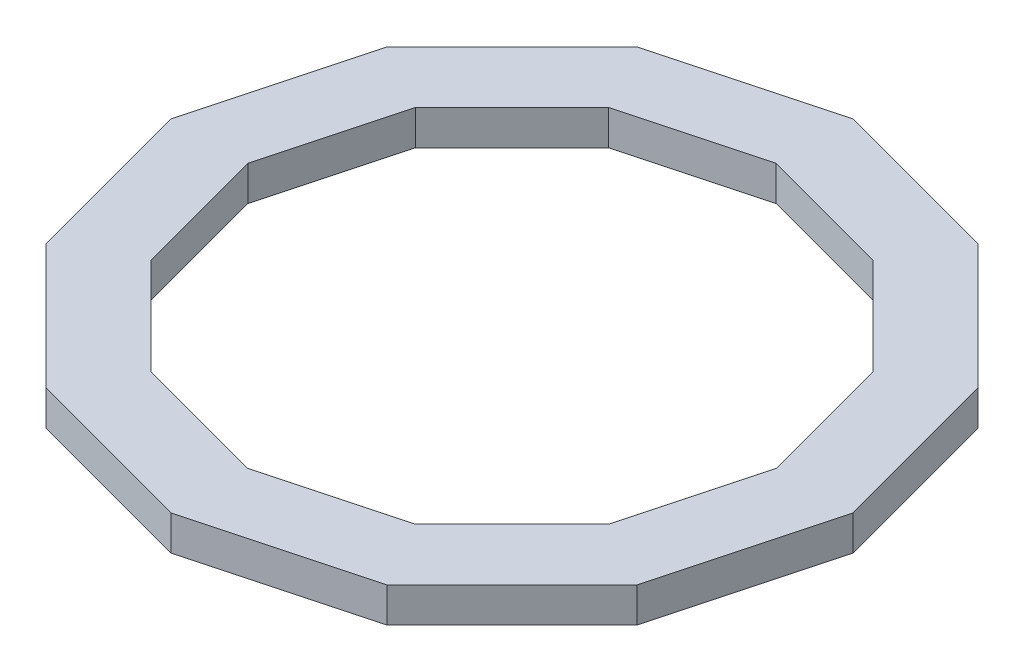
ISO-10303-21;
HEADER;
FILE_DESCRIPTION(('STEP AP214'),'2;1');
FILE_NAME('part.step','',(''),(''),'','','');
FILE_SCHEMA(('AUTOMOTIVE_DESIGN { 1 0 10303 214 1 1 1 1 }'));
ENDSEC;
DATA;
#1=APPLICATION_CONTEXT('core data for automotive mechanical design processes');
#2=APPLICATION_PROTOCOL_DEFINITION('international standard','automotive_design',2000,#1);
#3=PRODUCT_CONTEXT('',#1,'mechanical');
#4=PRODUCT('Part','Part','',(#3));
#5=PRODUCT_RELATED_PRODUCT_CATEGORY('part','',(#4));
#6=PRODUCT_DEFINITION_FORMATION('','',#4);
#7=PRODUCT_DEFINITION_CONTEXT('part definition',#1,'design');
#8=PRODUCT_DEFINITION('design','',#6,#7);
#9=PRODUCT_DEFINITION_SHAPE('','',#8);
#10=(LENGTH_UNIT() NAMED_UNIT(*) SI_UNIT(.MILLI.,.METRE.));
#11=(NAMED_UNIT(*) PLANE_ANGLE_UNIT() SI_UNIT($,.RADIAN.));
#12=(NAMED_UNIT(*) SI_UNIT($,.STERADIAN.) SOLID_ANGLE_UNIT());
#13=UNCERTAINTY_MEASURE_WITH_UNIT(LENGTH_MEASURE(1.E-05),#10,'distance_accuracy_value','');
#14=(GEOMETRIC_REPRESENTATION_CONTEXT(3) GLOBAL_UNCERTAINTY_ASSIGNED_CONTEXT((#13)) GLOBAL_UNIT_ASSIGNED_CONTEXT((#10,
#11,#12)) REPRESENTATION_CONTEXT('',''));
#15=CARTESIAN_POINT('',(0.,0.,0.));
#16=DIRECTION('',(0.,0.,1.));
#17=DIRECTION('',(1.,0.,0.));
#18=AXIS2_PLACEMENT_3D('',#15,#16,#17);
#19=CARTESIAN_POINT('',(0.,19.05,0.));
#20=DIRECTION('',(0.,1.,0.));
#21=DIRECTION('',(0.,0.,1.));
#22=AXIS2_PLACEMENT_3D('',#19,#20,#21);
#23=PLANE('',#22);
#24=DIRECTION('',(0.258819045102521,0.,-0.965925826289068));
#25=VECTOR('',#24,1.);
#26=CARTESIAN_POINT('',(161.481107273546,19.05,93.2311607534207));
#27=LINE('',#26,#25);
#28=CARTESIAN_POINT('',(161.481107273546,19.05,93.2311607534207));
#29=VERTEX_POINT('',#28);
#30=CARTESIAN_POINT('',(186.462321506841,19.05,0.));
#31=VERTEX_POINT('',#30);
#32=EDGE_CURVE('E292',#29,#31,#27,.T.);
#33=ORIENTED_EDGE('',*,*,#32,.T.);
#34=DIRECTION('',(-0.258819045102521,0.,-0.965925826289068));
#35=VECTOR('',#34,1.);
#36=CARTESIAN_POINT('',(186.462321506841,19.05,0.));
#37=LINE('',#36,#35);
#38=CARTESIAN_POINT('',(161.481107273546,19.05,-93.2311607534208));
#39=VERTEX_POINT('',#38);
#40=EDGE_CURVE('E295',#31,#39,#37,.T.);
#41=ORIENTED_EDGE('',*,*,#40,.T.);
#42=DIRECTION('',(-0.707106781186548,0.,-0.707106781186547));
#43=VECTOR('',#42,1.);
#44=CARTESIAN_POINT('',(161.481107273546,19.05,-93.2311607534208));
#45=LINE('',#44,#43);
#46=CARTESIAN_POINT('',(93.2311607534208,19.05,-161.481107273546));
#47=VERTEX_POINT('',#46);
#48=EDGE_CURVE('E298',#39,#47,#45,.T.);
#49=ORIENTED_EDGE('',*,*,#48,.T.);
#50=DIRECTION('',(-0.965925826289068,0.,-0.258819045102521));
#51=VECTOR('',#50,1.);
#52=CARTESIAN_POINT('',(93.2311607534208,19.05,-161.481107273546));
#53=LINE('',#52,#51);
#54=CARTESIAN_POINT('',(0.,19.05,-186.462321506841));
#55=VERTEX_POINT('',#54);
#56=EDGE_CURVE('E300',#47,#55,#53,.T.);
#57=ORIENTED_EDGE('',*,*,#56,.T.);
#58=DIRECTION('',(-0.965925826289068,0.,0.258819045102521));
#59=VECTOR('',#58,1.);
#60=CARTESIAN_POINT('',(0.,19.05,-186.462321506841));
#61=LINE('',#60,#59);
#62=CARTESIAN_POINT('',(-93.2311607534207,19.05,-161.481107273546));
#63=VERTEX_POINT('',#62);
#64=EDGE_CURVE('E302',#55,#63,#61,.T.);
#65=ORIENTED_EDGE('',*,*,#64,.T.);
#66=DIRECTION('',(-0.707106781186547,0.,0.707106781186548));
#67=VECTOR('',#66,1.);
#68=CARTESIAN_POINT('',(-93.2311607534207,19.05,-161.481107273546));
#69=LINE('',#68,#67);
#70=CARTESIAN_POINT('',(-161.481107273546,19.05,-93.2311607534207));
#71=VERTEX_POINT('',#70);
#72=EDGE_CURVE('E304',#63,#71,#69,.T.);
#73=ORIENTED_EDGE('',*,*,#72,.T.);
#74=DIRECTION('',(-0.258819045102521,0.,0.965925826289068));
#75=VECTOR('',#74,1.);
#76=CARTESIAN_POINT('',(-161.481107273546,19.05,-93.2311607534207));
#77=LINE('',#76,#75);
#78=CARTESIAN_POINT('',(-186.462321506841,19.05,1.50859272523053E-13));
#79=VERTEX_POINT('',#78);
#80=EDGE_CURVE('E306',#71,#79,#77,.T.);
#81=ORIENTED_EDGE('',*,*,#80,.T.);
#82=DIRECTION('',(0.258819045102521,0.,0.965925826289068));
#83=VECTOR('',#82,1.);
#84=CARTESIAN_POINT('',(-186.462321506841,19.05,1.50859272523053E-13));
#85=LINE('',#84,#83);
#86=CARTESIAN_POINT('',(-161.481107273546,19.05,93.2311607534208));
#87=VERTEX_POINT('',#86);
#88=EDGE_CURVE('E308',#79,#87,#85,.T.);
#89=ORIENTED_EDGE('',*,*,#88,.T.);
#90=DIRECTION('',(0.707106781186548,0.,0.707106781186547));
#91=VECTOR('',#90,1.);
#92=CARTESIAN_POINT('',(-161.481107273546,19.05,93.2311607534208));
#93=LINE('',#92,#91);
#94=CARTESIAN_POINT('',(-93.2311607534206,19.05,161.481107273546));
#95=VERTEX_POINT('',#94);
#96=EDGE_CURVE('E310',#87,#95,#93,.T.);
#97=ORIENTED_EDGE('',*,*,#96,.T.);
#98=DIRECTION('',(0.965925826289068,0.,0.258819045102521));
#99=VECTOR('',#98,1.);
#100=CARTESIAN_POINT('',(-93.2311607534206,19.05,161.481107273546));
#101=LINE('',#100,#99);
#102=CARTESIAN_POINT('',(0.,19.05,186.462321506841));
#103=VERTEX_POINT('',#102);
#104=EDGE_CURVE('E312',#95,#103,#101,.T.);
#105=ORIENTED_EDGE('',*,*,#104,.T.);
#106=DIRECTION('',(0.965925826289068,0.,-0.258819045102521));
#107=VECTOR('',#106,1.);
#108=CARTESIAN_POINT('',(0.,19.05,186.462321506841));
#109=LINE('',#108,#107);
#110=CARTESIAN_POINT('',(93.2311607534207,19.05,161.481107273546));
#111=VERTEX_POINT('',#110);
#112=EDGE_CURVE('E314',#103,#111,#109,.T.);
#113=ORIENTED_EDGE('',*,*,#112,.T.);
#114=DIRECTION('',(0.707106781186548,0.,-0.707106781186547));
#115=VECTOR('',#114,1.);
#116=CARTESIAN_POINT('',(93.2311607534207,19.05,161.481107273546));
#117=LINE('',#116,#115);
#118=EDGE_CURVE('E316',#111,#29,#117,.T.);
#119=ORIENTED_EDGE('',*,*,#118,.T.);
#120=EDGE_LOOP('',(#33,#41,#49,#57,#65,#73,#81,#89,#97,#105,#113,#119));
#121=FACE_BOUND('',#120,.T.);
#122=DIRECTION('',(-0.258819045102521,0.,-0.965925826289068));
#123=VECTOR('',#122,1.);
#124=CARTESIAN_POINT('',(144.388697534976,19.05,0.));
#125=LINE('',#124,#123);
#126=CARTESIAN_POINT('',(144.388697534976,19.05,0.));
#127=VERTEX_POINT('',#126);
#128=CARTESIAN_POINT('',(125.044280084636,19.05,-72.1943487674879));
#129=VERTEX_POINT('',#128);
#130=EDGE_CURVE('E203',#127,#129,#125,.T.);
#131=ORIENTED_EDGE('',*,*,#130,.F.);
#132=DIRECTION('',(0.25881904510252,0.,-0.965925826289068));
#133=VECTOR('',#132,1.);
#134=CARTESIAN_POINT('',(125.044280084636,19.05,72.1943487674877));
#135=LINE('',#134,#133);
#136=CARTESIAN_POINT('',(125.044280084636,19.05,72.1943487674877));
#137=VERTEX_POINT('',#136);
#138=EDGE_CURVE('E195',#137,#127,#135,.T.);
#139=ORIENTED_EDGE('',*,*,#138,.F.);
#140=DIRECTION('',(0.707106781186547,0.,-0.707106781186548));
#141=VECTOR('',#140,1.);
#142=CARTESIAN_POINT('',(72.1943487674878,19.05,125.044280084636));
#143=LINE('',#142,#141);
#144=CARTESIAN_POINT('',(72.1943487674878,19.05,125.044280084636));
#145=VERTEX_POINT('',#144);
#146=EDGE_CURVE('E237',#145,#137,#143,.T.);
#147=ORIENTED_EDGE('',*,*,#146,.F.);
#148=DIRECTION('',(0.965925826289068,0.,-0.258819045102521));
#149=VECTOR('',#148,1.);
#150=CARTESIAN_POINT('',(0.,19.05,144.388697534976));
#151=LINE('',#150,#149);
#152=CARTESIAN_POINT('',(0.,19.05,144.388697534976));
#153=VERTEX_POINT('',#152);
#154=EDGE_CURVE('E235',#153,#145,#151,.T.);
#155=ORIENTED_EDGE('',*,*,#154,.F.);
#156=DIRECTION('',(0.965925826289068,0.,0.25881904510252));
#157=VECTOR('',#156,1.);
#158=CARTESIAN_POINT('',(-72.1943487674877,19.05,125.044280084636));
#159=LINE('',#158,#157);
#160=CARTESIAN_POINT('',(-72.1943487674877,19.05,125.044280084636));
#161=VERTEX_POINT('',#160);
#162=EDGE_CURVE('E233',#161,#153,#159,.T.);
#163=ORIENTED_EDGE('',*,*,#162,.F.);
#164=DIRECTION('',(0.707106781186548,0.,0.707106781186547));
#165=VECTOR('',#164,1.);
#166=CARTESIAN_POINT('',(-125.044280084636,19.05,72.1943487674879));
#167=LINE('',#166,#165);
#168=CARTESIAN_POINT('',(-125.044280084636,19.05,72.1943487674879));
#169=VERTEX_POINT('',#168);
#170=EDGE_CURVE('E231',#169,#161,#167,.T.);
#171=ORIENTED_EDGE('',*,*,#170,.F.);
#172=DIRECTION('',(0.258819045102522,0.,0.965925826289068));
#173=VECTOR('',#172,1.);
#174=CARTESIAN_POINT('',(-144.388697534976,19.05,0.));
#175=LINE('',#174,#173);
#176=CARTESIAN_POINT('',(-144.388697534976,19.05,0.));
#177=VERTEX_POINT('',#176);
#178=EDGE_CURVE('E228',#177,#169,#175,.T.);
#179=ORIENTED_EDGE('',*,*,#178,.F.);
#180=DIRECTION('',(-0.258819045102521,0.,0.965925826289068));
#181=VECTOR('',#180,1.);
#182=CARTESIAN_POINT('',(-125.044280084636,19.05,-72.1943487674877));
#183=LINE('',#182,#181);
#184=CARTESIAN_POINT('',(-125.044280084636,19.05,-72.1943487674877));
#185=VERTEX_POINT('',#184);
#186=EDGE_CURVE('E226',#185,#177,#183,.T.);
#187=ORIENTED_EDGE('',*,*,#186,.F.);
#188=DIRECTION('',(-0.707106781186547,0.,0.707106781186548));
#189=VECTOR('',#188,1.);
#190=CARTESIAN_POINT('',(-72.1943487674878,19.05,-125.044280084636));
#191=LINE('',#190,#189);
#192=CARTESIAN_POINT('',(-72.1943487674878,19.05,-125.044280084636));
#193=VERTEX_POINT('',#192);
#194=EDGE_CURVE('E224',#193,#185,#191,.T.);
#195=ORIENTED_EDGE('',*,*,#194,.F.);
#196=DIRECTION('',(-0.965925826289068,0.,0.258819045102521));
#197=VECTOR('',#196,1.);
#198=CARTESIAN_POINT('',(0.,19.05,-144.388697534976));
#199=LINE('',#198,#197);
#200=CARTESIAN_POINT('',(0.,19.05,-144.388697534976));
#201=VERTEX_POINT('',#200);
#202=EDGE_CURVE('E222',#201,#193,#199,.T.);
#203=ORIENTED_EDGE('',*,*,#202,.F.);
#204=DIRECTION('',(-0.965925826289068,0.,-0.25881904510252));
#205=VECTOR('',#204,1.);
#206=CARTESIAN_POINT('',(72.1943487674877,19.05,-125.044280084636));
#207=LINE('',#206,#205);
#208=CARTESIAN_POINT('',(72.1943487674877,19.05,-125.044280084636));
#209=VERTEX_POINT('',#208);
#210=EDGE_CURVE('E218',#209,#201,#207,.T.);
#211=ORIENTED_EDGE('',*,*,#210,.F.);
#212=DIRECTION('',(-0.707106781186548,0.,-0.707106781186547));
#213=VECTOR('',#212,1.);
#214=CARTESIAN_POINT('',(125.044280084636,19.05,-72.1943487674879));
#215=LINE('',#214,#213);
#216=EDGE_CURVE('E216',#129,#209,#215,.T.);
#217=ORIENTED_EDGE('',*,*,#216,.F.);
#218=EDGE_LOOP('',(#131,#139,#147,#155,#163,#171,#179,#187,#195,#203,#211,#217));
#219=FACE_BOUND('',#218,.T.);
#220=ADVANCED_FACE('F34',(#121,#219),#23,.T.);
#221=CARTESIAN_POINT('',(0.,0.,0.));
#222=DIRECTION('',(0.,1.,0.));
#223=DIRECTION('',(0.,0.,1.));
#224=AXIS2_PLACEMENT_3D('',#221,#222,#223);
#225=PLANE('',#224);
#226=DIRECTION('',(0.258819045102521,0.,-0.965925826289068));
#227=VECTOR('',#226,1.);
#228=CARTESIAN_POINT('',(161.481107273546,0.,93.2311607534207));
#229=LINE('',#228,#227);
#230=CARTESIAN_POINT('',(161.481107273546,0.,93.2311607534207));
#231=VERTEX_POINT('',#230);
#232=CARTESIAN_POINT('',(186.462321506841,0.,0.));
#233=VERTEX_POINT('',#232);
#234=EDGE_CURVE('E211',#231,#233,#229,.T.);
#235=ORIENTED_EDGE('',*,*,#234,.F.);
#236=DIRECTION('',(0.707106781186548,0.,-0.707106781186547));
#237=VECTOR('',#236,1.);
#238=CARTESIAN_POINT('',(93.2311607534207,0.,161.481107273546));
#239=LINE('',#238,#237);
#240=CARTESIAN_POINT('',(93.2311607534207,0.,161.481107273546));
#241=VERTEX_POINT('',#240);
#242=EDGE_CURVE('E296',#241,#231,#239,.T.);
#243=ORIENTED_EDGE('',*,*,#242,.F.);
#244=DIRECTION('',(0.965925826289068,0.,-0.258819045102521));
#245=VECTOR('',#244,1.);
#246=CARTESIAN_POINT('',(0.,0.,186.462321506841));
#247=LINE('',#246,#245);
#248=CARTESIAN_POINT('',(0.,0.,186.462321506841));
#249=VERTEX_POINT('',#248);
#250=EDGE_CURVE('E341',#249,#241,#247,.T.);
#251=ORIENTED_EDGE('',*,*,#250,.F.);
#252=DIRECTION('',(0.965925826289068,0.,0.258819045102521));
#253=VECTOR('',#252,1.);
#254=CARTESIAN_POINT('',(-93.2311607534206,0.,161.481107273546));
#255=LINE('',#254,#253);
#256=CARTESIAN_POINT('',(-93.2311607534206,0.,161.481107273546));
#257=VERTEX_POINT('',#256);
#258=EDGE_CURVE('E338',#257,#249,#255,.T.);
#259=ORIENTED_EDGE('',*,*,#258,.F.);
#260=DIRECTION('',(0.707106781186548,0.,0.707106781186547));
#261=VECTOR('',#260,1.);
#262=CARTESIAN_POINT('',(-161.481107273546,0.,93.2311607534208));
#263=LINE('',#262,#261);
#264=CARTESIAN_POINT('',(-161.481107273546,0.,93.2311607534208));
#265=VERTEX_POINT('',#264);
#266=EDGE_CURVE('E336',#265,#257,#263,.T.);
#267=ORIENTED_EDGE('',*,*,#266,.F.);
#268=DIRECTION('',(0.258819045102521,0.,0.965925826289068));
#269=VECTOR('',#268,1.);
#270=CARTESIAN_POINT('',(-186.462321506841,0.,1.50859272523053E-13));
#271=LINE('',#270,#269);
#272=CARTESIAN_POINT('',(-186.462321506841,0.,1.50859272523053E-13));
#273=VERTEX_POINT('',#272);
#274=EDGE_CURVE('E333',#273,#265,#271,.T.);
#275=ORIENTED_EDGE('',*,*,#274,.F.);
#276=DIRECTION('',(-0.258819045102521,0.,0.965925826289068));
#277=VECTOR('',#276,1.);
#278=CARTESIAN_POINT('',(-161.481107273546,0.,-93.2311607534207));
#279=LINE('',#278,#277);
#280=CARTESIAN_POINT('',(-161.481107273546,0.,-93.2311607534207));
#281=VERTEX_POINT('',#280);
#282=EDGE_CURVE('E331',#281,#273,#279,.T.);
#283=ORIENTED_EDGE('',*,*,#282,.F.);
#284=DIRECTION('',(-0.707106781186547,0.,0.707106781186548));
#285=VECTOR('',#284,1.);
#286=CARTESIAN_POINT('',(-93.2311607534207,0.,-161.481107273546));
#287=LINE('',#286,#285);
#288=CARTESIAN_POINT('',(-93.2311607534207,0.,-161.481107273546));
#289=VERTEX_POINT('',#288);
#290=EDGE_CURVE('E329',#289,#281,#287,.T.);
#291=ORIENTED_EDGE('',*,*,#290,.F.);
#292=DIRECTION('',(-0.965925826289068,0.,0.258819045102521));
#293=VECTOR('',#292,1.);
#294=CARTESIAN_POINT('',(0.,0.,-186.462321506841));
#295=LINE('',#294,#293);
#296=CARTESIAN_POINT('',(0.,0.,-186.462321506841));
#297=VERTEX_POINT('',#296);
#298=EDGE_CURVE('E327',#297,#289,#295,.T.);
#299=ORIENTED_EDGE('',*,*,#298,.F.);
#300=DIRECTION('',(-0.965925826289068,0.,-0.258819045102521));
#301=VECTOR('',#300,1.);
#302=CARTESIAN_POINT('',(93.2311607534208,0.,-161.481107273546));
#303=LINE('',#302,#301);
#304=CARTESIAN_POINT('',(93.2311607534208,0.,-161.481107273546));
#305=VERTEX_POINT('',#304);
#306=EDGE_CURVE('E325',#305,#297,#303,.T.);
#307=ORIENTED_EDGE('',*,*,#306,.F.);
#308=DIRECTION('',(-0.707106781186548,0.,-0.707106781186547));
#309=VECTOR('',#308,1.);
#310=CARTESIAN_POINT('',(161.481107273546,0.,-93.2311607534208));
#311=LINE('',#310,#309);
#312=CARTESIAN_POINT('',(161.481107273546,0.,-93.2311607534208));
#313=VERTEX_POINT('',#312);
#314=EDGE_CURVE('E323',#313,#305,#311,.T.);
#315=ORIENTED_EDGE('',*,*,#314,.F.);
#316=DIRECTION('',(-0.258819045102521,0.,-0.965925826289068));
#317=VECTOR('',#316,1.);
#318=CARTESIAN_POINT('',(186.462321506841,0.,0.));
#319=LINE('',#318,#317);
#320=EDGE_CURVE('E321',#233,#313,#319,.T.);
#321=ORIENTED_EDGE('',*,*,#320,.F.);
#322=EDGE_LOOP('',(#235,#243,#251,#259,#267,#275,#283,#291,#299,#307,#315,#321));
#323=FACE_BOUND('',#322,.T.);
#324=DIRECTION('',(0.25881904510252,0.,-0.965925826289068));
#325=VECTOR('',#324,1.);
#326=CARTESIAN_POINT('',(125.044280084636,0.,72.1943487674877));
#327=LINE('',#326,#325);
#328=CARTESIAN_POINT('',(125.044280084636,0.,72.1943487674877));
#329=VERTEX_POINT('',#328);
#330=CARTESIAN_POINT('',(144.388697534976,0.,0.));
#331=VERTEX_POINT('',#330);
#332=EDGE_CURVE('E57',#329,#331,#327,.T.);
#333=ORIENTED_EDGE('',*,*,#332,.T.);
#334=DIRECTION('',(-0.258819045102521,0.,-0.965925826289068));
#335=VECTOR('',#334,1.);
#336=CARTESIAN_POINT('',(144.388697534976,0.,0.));
#337=LINE('',#336,#335);
#338=CARTESIAN_POINT('',(125.044280084636,0.,-72.1943487674879));
#339=VERTEX_POINT('',#338);
#340=EDGE_CURVE('E210',#331,#339,#337,.T.);
#341=ORIENTED_EDGE('',*,*,#340,.T.);
#342=DIRECTION('',(-0.707106781186548,0.,-0.707106781186547));
#343=VECTOR('',#342,1.);
#344=CARTESIAN_POINT('',(125.044280084636,0.,-72.1943487674879));
#345=LINE('',#344,#343);
#346=CARTESIAN_POINT('',(72.1943487674877,0.,-125.044280084636));
#347=VERTEX_POINT('',#346);
#348=EDGE_CURVE('E241',#339,#347,#345,.T.);
#349=ORIENTED_EDGE('',*,*,#348,.T.);
#350=DIRECTION('',(-0.965925826289068,0.,-0.25881904510252));
#351=VECTOR('',#350,1.);
#352=CARTESIAN_POINT('',(72.1943487674877,0.,-125.044280084636));
#353=LINE('',#352,#351);
#354=CARTESIAN_POINT('',(0.,0.,-144.388697534976));
#355=VERTEX_POINT('',#354);
#356=EDGE_CURVE('E244',#347,#355,#353,.T.);
#357=ORIENTED_EDGE('',*,*,#356,.T.);
#358=DIRECTION('',(-0.965925826289068,0.,0.258819045102521));
#359=VECTOR('',#358,1.);
#360=CARTESIAN_POINT('',(0.,0.,-144.388697534976));
#361=LINE('',#360,#359);
#362=CARTESIAN_POINT('',(-72.1943487674878,0.,-125.044280084636));
#363=VERTEX_POINT('',#362);
#364=EDGE_CURVE('E247',#355,#363,#361,.T.);
#365=ORIENTED_EDGE('',*,*,#364,.T.);
#366=DIRECTION('',(-0.707106781186547,0.,0.707106781186548));
#367=VECTOR('',#366,1.);
#368=CARTESIAN_POINT('',(-72.1943487674878,0.,-125.044280084636));
#369=LINE('',#368,#367);
#370=CARTESIAN_POINT('',(-125.044280084636,0.,-72.1943487674877));
#371=VERTEX_POINT('',#370);
#372=EDGE_CURVE('E251',#363,#371,#369,.T.);
#373=ORIENTED_EDGE('',*,*,#372,.T.);
#374=DIRECTION('',(-0.258819045102521,0.,0.965925826289068));
#375=VECTOR('',#374,1.);
#376=CARTESIAN_POINT('',(-125.044280084636,0.,-72.1943487674877));
#377=LINE('',#376,#375);
#378=CARTESIAN_POINT('',(-144.388697534976,0.,0.));
#379=VERTEX_POINT('',#378);
#380=EDGE_CURVE('E254',#371,#379,#377,.T.);
#381=ORIENTED_EDGE('',*,*,#380,.T.);
#382=DIRECTION('',(0.258819045102522,0.,0.965925826289068));
#383=VECTOR('',#382,1.);
#384=CARTESIAN_POINT('',(-144.388697534976,0.,0.));
#385=LINE('',#384,#383);
#386=CARTESIAN_POINT('',(-125.044280084636,0.,72.1943487674879));
#387=VERTEX_POINT('',#386);
#388=EDGE_CURVE('E257',#379,#387,#385,.T.);
#389=ORIENTED_EDGE('',*,*,#388,.T.);
#390=DIRECTION('',(0.707106781186548,0.,0.707106781186547));
#391=VECTOR('',#390,1.);
#392=CARTESIAN_POINT('',(-125.044280084636,0.,72.1943487674879));
#393=LINE('',#392,#391);
#394=CARTESIAN_POINT('',(-72.1943487674877,0.,125.044280084636));
#395=VERTEX_POINT('',#394);
#396=EDGE_CURVE('E260',#387,#395,#393,.T.);
#397=ORIENTED_EDGE('',*,*,#396,.T.);
#398=DIRECTION('',(0.965925826289068,0.,0.25881904510252));
#399=VECTOR('',#398,1.);
#400=CARTESIAN_POINT('',(-72.1943487674877,0.,125.044280084636));
#401=LINE('',#400,#399);
#402=CARTESIAN_POINT('',(0.,0.,144.388697534976));
#403=VERTEX_POINT('',#402);
#404=EDGE_CURVE('E263',#395,#403,#401,.T.);
#405=ORIENTED_EDGE('',*,*,#404,.T.);
#406=DIRECTION('',(0.965925826289068,0.,-0.258819045102521));
#407=VECTOR('',#406,1.);
#408=CARTESIAN_POINT('',(0.,0.,144.388697534976));
#409=LINE('',#408,#407);
#410=CARTESIAN_POINT('',(72.1943487674878,0.,125.044280084636));
#411=VERTEX_POINT('',#410);
#412=EDGE_CURVE('E266',#403,#411,#409,.T.);
#413=ORIENTED_EDGE('',*,*,#412,.T.);
#414=DIRECTION('',(0.707106781186547,0.,-0.707106781186548));
#415=VECTOR('',#414,1.);
#416=CARTESIAN_POINT('',(72.1943487674878,0.,125.044280084636));
#417=LINE('',#416,#415);
#418=EDGE_CURVE('E204',#411,#329,#417,.T.);
#419=ORIENTED_EDGE('',*,*,#418,.T.);
#420=EDGE_LOOP('',(#333,#341,#349,#357,#365,#373,#381,#389,#397,#405,#413,#419));
#421=FACE_BOUND('',#420,.T.);
#422=ADVANCED_FACE('F383',(#323,#421),#225,.F.);
#423=CARTESIAN_POINT('',(161.481107273546,19.05,93.2311607534207));
#424=DIRECTION('',(-0.965925826289068,0.,-0.258819045102521));
#425=DIRECTION('',(-0.258819045102521,0.,0.965925826289068));
#426=AXIS2_PLACEMENT_3D('',#423,#424,#425);
#427=PLANE('',#426);
#428=ORIENTED_EDGE('',*,*,#234,.T.);
#429=DIRECTION('',(0.,-1.,0.));
#430=VECTOR('',#429,1.);
#431=CARTESIAN_POINT('',(186.462321506841,19.05,0.));
#432=LINE('',#431,#430);
#433=EDGE_CURVE('E11',#31,#233,#432,.T.);
#434=ORIENTED_EDGE('',*,*,#433,.F.);
#435=ORIENTED_EDGE('',*,*,#32,.F.);
#436=DIRECTION('',(0.,-1.,0.));
#437=VECTOR('',#436,1.);
#438=CARTESIAN_POINT('',(161.481107273546,19.05,93.2311607534207));
#439=LINE('',#438,#437);
#440=EDGE_CURVE('E318',#29,#231,#439,.T.);
#441=ORIENTED_EDGE('',*,*,#440,.T.);
#442=EDGE_LOOP('',(#428,#434,#435,#441));
#443=FACE_BOUND('',#442,.T.);
#444=ADVANCED_FACE('F36',(#443),#427,.F.);
#445=CARTESIAN_POINT('',(186.462321506841,19.05,0.));
#446=DIRECTION('',(-0.965925826289068,0.,0.258819045102521));
#447=DIRECTION('',(0.258819045102521,0.,0.965925826289068));
#448=AXIS2_PLACEMENT_3D('',#445,#446,#447);
#449=PLANE('',#448);
#450=ORIENTED_EDGE('',*,*,#320,.T.);
#451=DIRECTION('',(0.,-1.,0.));
#452=VECTOR('',#451,1.);
#453=CARTESIAN_POINT('',(161.481107273546,19.05,-93.2311607534208));
#454=LINE('',#453,#452);
#455=EDGE_CURVE('E42',#39,#313,#454,.T.);
#456=ORIENTED_EDGE('',*,*,#455,.F.);
#457=ORIENTED_EDGE('',*,*,#40,.F.);
#458=ORIENTED_EDGE('',*,*,#433,.T.);
#459=EDGE_LOOP('',(#450,#456,#457,#458));
#460=FACE_BOUND('',#459,.T.);
#461=ADVANCED_FACE('F400',(#460),#449,.F.);
#462=CARTESIAN_POINT('',(161.481107273546,19.05,-93.2311607534208));
#463=DIRECTION('',(-0.707106781186547,0.,0.707106781186548));
#464=DIRECTION('',(0.707106781186548,0.,0.707106781186547));
#465=AXIS2_PLACEMENT_3D('',#462,#463,#464);
#466=PLANE('',#465);
#467=ORIENTED_EDGE('',*,*,#314,.T.);
#468=DIRECTION('',(0.,-1.,0.));
#469=VECTOR('',#468,1.);
#470=CARTESIAN_POINT('',(93.2311607534208,19.05,-161.481107273546));
#471=LINE('',#470,#469);
#472=EDGE_CURVE('E370',#47,#305,#471,.T.);
#473=ORIENTED_EDGE('',*,*,#472,.F.);
#474=ORIENTED_EDGE('',*,*,#48,.F.);
#475=ORIENTED_EDGE('',*,*,#455,.T.);
#476=EDGE_LOOP('',(#467,#473,#474,#475));
#477=FACE_BOUND('',#476,.T.);
#478=ADVANCED_FACE('F377',(#477),#466,.F.);
#479=CARTESIAN_POINT('',(93.2311607534208,19.05,-161.481107273546));
#480=DIRECTION('',(-0.258819045102521,0.,0.965925826289068));
#481=DIRECTION('',(0.965925826289068,0.,0.258819045102521));
#482=AXIS2_PLACEMENT_3D('',#479,#480,#481);
#483=PLANE('',#482);
#484=ORIENTED_EDGE('',*,*,#306,.T.);
#485=DIRECTION('',(0.,-1.,0.));
#486=VECTOR('',#485,1.);
#487=CARTESIAN_POINT('',(0.,19.05,-186.462321506841));
#488=LINE('',#487,#486);
#489=EDGE_CURVE('E367',#55,#297,#488,.T.);
#490=ORIENTED_EDGE('',*,*,#489,.F.);
#491=ORIENTED_EDGE('',*,*,#56,.F.);
#492=ORIENTED_EDGE('',*,*,#472,.T.);
#493=EDGE_LOOP('',(#484,#490,#491,#492));
#494=FACE_BOUND('',#493,.T.);
#495=ADVANCED_FACE('F389',(#494),#483,.F.);
#496=CARTESIAN_POINT('',(0.,19.05,-186.462321506841));
#497=DIRECTION('',(0.258819045102521,0.,0.965925826289068));
#498=DIRECTION('',(0.965925826289068,0.,-0.258819045102521));
#499=AXIS2_PLACEMENT_3D('',#496,#497,#498);
#500=PLANE('',#499);
#501=ORIENTED_EDGE('',*,*,#298,.T.);
#502=DIRECTION('',(0.,-1.,0.));
#503=VECTOR('',#502,1.);
#504=CARTESIAN_POINT('',(-93.2311607534207,19.05,-161.481107273546));
#505=LINE('',#504,#503);
#506=EDGE_CURVE('E364',#63,#289,#505,.T.);
#507=ORIENTED_EDGE('',*,*,#506,.F.);
#508=ORIENTED_EDGE('',*,*,#64,.F.);
#509=ORIENTED_EDGE('',*,*,#489,.T.);
#510=EDGE_LOOP('',(#501,#507,#508,#509));
#511=FACE_BOUND('',#510,.T.);
#512=ADVANCED_FACE('F393',(#511),#500,.F.);
#513=CARTESIAN_POINT('',(-93.2311607534207,19.05,-161.481107273546));
#514=DIRECTION('',(0.707106781186548,0.,0.707106781186547));
#515=DIRECTION('',(0.707106781186547,0.,-0.707106781186548));
#516=AXIS2_PLACEMENT_3D('',#513,#514,#515);
#517=PLANE('',#516);
#518=ORIENTED_EDGE('',*,*,#290,.T.);
#519=DIRECTION('',(0.,-1.,0.));
#520=VECTOR('',#519,1.);
#521=CARTESIAN_POINT('',(-161.481107273546,19.05,-93.2311607534207));
#522=LINE('',#521,#520);
#523=EDGE_CURVE('E361',#71,#281,#522,.T.);
#524=ORIENTED_EDGE('',*,*,#523,.F.);
#525=ORIENTED_EDGE('',*,*,#72,.F.);
#526=ORIENTED_EDGE('',*,*,#506,.T.);
#527=EDGE_LOOP('',(#518,#524,#525,#526));
#528=FACE_BOUND('',#527,.T.);
#529=ADVANCED_FACE('F433',(#528),#517,.F.);
#530=CARTESIAN_POINT('',(-161.481107273546,19.05,-93.2311607534207));
#531=DIRECTION('',(0.965925826289068,0.,0.258819045102521));
#532=DIRECTION('',(0.258819045102521,0.,-0.965925826289068));
#533=AXIS2_PLACEMENT_3D('',#530,#531,#532);
#534=PLANE('',#533);
#535=ORIENTED_EDGE('',*,*,#282,.T.);
#536=DIRECTION('',(0.,-1.,0.));
#537=VECTOR('',#536,1.);
#538=CARTESIAN_POINT('',(-186.462321506841,19.05,1.50859272523053E-13));
#539=LINE('',#538,#537);
#540=EDGE_CURVE('E358',#79,#273,#539,.T.);
#541=ORIENTED_EDGE('',*,*,#540,.F.);
#542=ORIENTED_EDGE('',*,*,#80,.F.);
#543=ORIENTED_EDGE('',*,*,#523,.T.);
#544=EDGE_LOOP('',(#535,#541,#542,#543));
#545=FACE_BOUND('',#544,.T.);
#546=ADVANCED_FACE('F431',(#545),#534,.F.);
#547=CARTESIAN_POINT('',(-186.462321506841,19.05,1.50859272523053E-13));
#548=DIRECTION('',(0.965925826289068,0.,-0.258819045102521));
#549=DIRECTION('',(-0.258819045102521,0.,-0.965925826289068));
#550=AXIS2_PLACEMENT_3D('',#547,#548,#549);
#551=PLANE('',#550);
#552=ORIENTED_EDGE('',*,*,#274,.T.);
#553=DIRECTION('',(0.,-1.,0.));
#554=VECTOR('',#553,1.);
#555=CARTESIAN_POINT('',(-161.481107273546,19.05,93.2311607534208));
#556=LINE('',#555,#554);
#557=EDGE_CURVE('E355',#87,#265,#556,.T.);
#558=ORIENTED_EDGE('',*,*,#557,.F.);
#559=ORIENTED_EDGE('',*,*,#88,.F.);
#560=ORIENTED_EDGE('',*,*,#540,.T.);
#561=EDGE_LOOP('',(#552,#558,#559,#560));
#562=FACE_BOUND('',#561,.T.);
#563=ADVANCED_FACE('F427',(#562),#551,.F.);
#564=CARTESIAN_POINT('',(-161.481107273546,19.05,93.2311607534208));
#565=DIRECTION('',(0.707106781186547,0.,-0.707106781186548));
#566=DIRECTION('',(-0.707106781186548,0.,-0.707106781186547));
#567=AXIS2_PLACEMENT_3D('',#564,#565,#566);
#568=PLANE('',#567);
#569=ORIENTED_EDGE('',*,*,#266,.T.);
#570=DIRECTION('',(0.,-1.,0.));
#571=VECTOR('',#570,1.);
#572=CARTESIAN_POINT('',(-93.2311607534206,19.05,161.481107273546));
#573=LINE('',#572,#571);
#574=EDGE_CURVE('E352',#95,#257,#573,.T.);
#575=ORIENTED_EDGE('',*,*,#574,.F.);
#576=ORIENTED_EDGE('',*,*,#96,.F.);
#577=ORIENTED_EDGE('',*,*,#557,.T.);
#578=EDGE_LOOP('',(#569,#575,#576,#577));
#579=FACE_BOUND('',#578,.T.);
#580=ADVANCED_FACE('F422',(#579),#568,.F.);
#581=CARTESIAN_POINT('',(-93.2311607534206,19.05,161.481107273546));
#582=DIRECTION('',(0.258819045102521,0.,-0.965925826289068));
#583=DIRECTION('',(-0.965925826289068,0.,-0.258819045102521));
#584=AXIS2_PLACEMENT_3D('',#581,#582,#583);
#585=PLANE('',#584);
#586=ORIENTED_EDGE('',*,*,#258,.T.);
#587=DIRECTION('',(0.,-1.,0.));
#588=VECTOR('',#587,1.);
#589=CARTESIAN_POINT('',(0.,19.05,186.462321506841));
#590=LINE('',#589,#588);
#591=EDGE_CURVE('E349',#103,#249,#590,.T.);
#592=ORIENTED_EDGE('',*,*,#591,.F.);
#593=ORIENTED_EDGE('',*,*,#104,.F.);
#594=ORIENTED_EDGE('',*,*,#574,.T.);
#595=EDGE_LOOP('',(#586,#592,#593,#594));
#596=FACE_BOUND('',#595,.T.);
#597=ADVANCED_FACE('F416',(#596),#585,.F.);
#598=CARTESIAN_POINT('',(0.,19.05,186.462321506841));
#599=DIRECTION('',(-0.258819045102521,0.,-0.965925826289068));
#600=DIRECTION('',(-0.965925826289068,0.,0.258819045102521));
#601=AXIS2_PLACEMENT_3D('',#598,#599,#600);
#602=PLANE('',#601);
#603=ORIENTED_EDGE('',*,*,#250,.T.);
#604=DIRECTION('',(0.,-1.,0.));
#605=VECTOR('',#604,1.);
#606=CARTESIAN_POINT('',(93.2311607534207,19.05,161.481107273546));
#607=LINE('',#606,#605);
#608=EDGE_CURVE('E346',#111,#241,#607,.T.);
#609=ORIENTED_EDGE('',*,*,#608,.F.);
#610=ORIENTED_EDGE('',*,*,#112,.F.);
#611=ORIENTED_EDGE('',*,*,#591,.T.);
#612=EDGE_LOOP('',(#603,#609,#610,#611));
#613=FACE_BOUND('',#612,.T.);
#614=ADVANCED_FACE('F412',(#613),#602,.F.);
#615=CARTESIAN_POINT('',(93.2311607534207,19.05,161.481107273546));
#616=DIRECTION('',(-0.707106781186547,0.,-0.707106781186548));
#617=DIRECTION('',(-0.707106781186548,0.,0.707106781186547));
#618=AXIS2_PLACEMENT_3D('',#615,#616,#617);
#619=PLANE('',#618);
#620=ORIENTED_EDGE('',*,*,#242,.T.);
#621=ORIENTED_EDGE('',*,*,#440,.F.);
#622=ORIENTED_EDGE('',*,*,#118,.F.);
#623=ORIENTED_EDGE('',*,*,#608,.T.);
#624=EDGE_LOOP('',(#620,#621,#622,#623));
#625=FACE_BOUND('',#624,.T.);
#626=ADVANCED_FACE('F407',(#625),#619,.F.);
#627=CARTESIAN_POINT('',(125.044280084636,19.05,72.1943487674877));
#628=DIRECTION('',(-0.965925826289068,0.,-0.25881904510252));
#629=DIRECTION('',(-0.258819045102521,0.,0.965925826289069));
#630=AXIS2_PLACEMENT_3D('',#627,#628,#629);
#631=PLANE('',#630);
#632=ORIENTED_EDGE('',*,*,#332,.F.);
#633=DIRECTION('',(0.,-1.,0.));
#634=VECTOR('',#633,1.);
#635=CARTESIAN_POINT('',(125.044280084636,19.05,72.1943487674877));
#636=LINE('',#635,#634);
#637=EDGE_CURVE('E199',#137,#329,#636,.T.);
#638=ORIENTED_EDGE('',*,*,#637,.F.);
#639=ORIENTED_EDGE('',*,*,#138,.T.);
#640=DIRECTION('',(0.,-1.,0.));
#641=VECTOR('',#640,1.);
#642=CARTESIAN_POINT('',(144.388697534976,19.05,0.));
#643=LINE('',#642,#641);
#644=EDGE_CURVE('E198',#127,#331,#643,.T.);
#645=ORIENTED_EDGE('',*,*,#644,.T.);
#646=EDGE_LOOP('',(#632,#638,#639,#645));
#647=FACE_BOUND('',#646,.T.);
#648=ADVANCED_FACE('F197',(#647),#631,.T.);
#649=CARTESIAN_POINT('',(144.388697534976,19.05,0.));
#650=DIRECTION('',(-0.965925826289068,0.,0.258819045102521));
#651=DIRECTION('',(0.258819045102521,0.,0.965925826289068));
#652=AXIS2_PLACEMENT_3D('',#649,#650,#651);
#653=PLANE('',#652);
#654=ORIENTED_EDGE('',*,*,#340,.F.);
#655=ORIENTED_EDGE('',*,*,#644,.F.);
#656=ORIENTED_EDGE('',*,*,#130,.T.);
#657=DIRECTION('',(0.,-1.,0.));
#658=VECTOR('',#657,1.);
#659=CARTESIAN_POINT('',(125.044280084636,19.05,-72.1943487674879));
#660=LINE('',#659,#658);
#661=EDGE_CURVE('E212',#129,#339,#660,.T.);
#662=ORIENTED_EDGE('',*,*,#661,.T.);
#663=EDGE_LOOP('',(#654,#655,#656,#662));
#664=FACE_BOUND('',#663,.T.);
#665=ADVANCED_FACE('F207',(#664),#653,.T.);
#666=CARTESIAN_POINT('',(125.044280084636,19.05,-72.1943487674879));
#667=DIRECTION('',(-0.707106781186547,0.,0.707106781186548));
#668=DIRECTION('',(0.707106781186548,0.,0.707106781186547));
#669=AXIS2_PLACEMENT_3D('',#666,#667,#668);
#670=PLANE('',#669);
#671=ORIENTED_EDGE('',*,*,#348,.F.);
#672=ORIENTED_EDGE('',*,*,#661,.F.);
#673=ORIENTED_EDGE('',*,*,#216,.T.);
#674=DIRECTION('',(0.,-1.,0.));
#675=VECTOR('',#674,1.);
#676=CARTESIAN_POINT('',(72.1943487674877,19.05,-125.044280084636));
#677=LINE('',#676,#675);
#678=EDGE_CURVE('E289',#209,#347,#677,.T.);
#679=ORIENTED_EDGE('',*,*,#678,.T.);
#680=EDGE_LOOP('',(#671,#672,#673,#679));
#681=FACE_BOUND('',#680,.T.);
#682=ADVANCED_FACE('F491',(#681),#670,.T.);
#683=CARTESIAN_POINT('',(72.1943487674877,19.05,-125.044280084636));
#684=DIRECTION('',(-0.25881904510252,0.,0.965925826289068));
#685=DIRECTION('',(0.965925826289068,0.,0.25881904510252));
#686=AXIS2_PLACEMENT_3D('',#683,#684,#685);
#687=PLANE('',#686);
#688=ORIENTED_EDGE('',*,*,#356,.F.);
#689=ORIENTED_EDGE('',*,*,#678,.F.);
#690=ORIENTED_EDGE('',*,*,#210,.T.);
#691=DIRECTION('',(0.,-1.,0.));
#692=VECTOR('',#691,1.);
#693=CARTESIAN_POINT('',(0.,19.05,-144.388697534976));
#694=LINE('',#693,#692);
#695=EDGE_CURVE('E286',#201,#355,#694,.T.);
#696=ORIENTED_EDGE('',*,*,#695,.T.);
#697=EDGE_LOOP('',(#688,#689,#690,#696));
#698=FACE_BOUND('',#697,.T.);
#699=ADVANCED_FACE('F497',(#698),#687,.T.);
#700=CARTESIAN_POINT('',(0.,19.05,-144.388697534976));
#701=DIRECTION('',(0.258819045102521,0.,0.965925826289068));
#702=DIRECTION('',(0.965925826289068,0.,-0.258819045102521));
#703=AXIS2_PLACEMENT_3D('',#700,#701,#702);
#704=PLANE('',#703);
#705=ORIENTED_EDGE('',*,*,#364,.F.);
#706=ORIENTED_EDGE('',*,*,#695,.F.);
#707=ORIENTED_EDGE('',*,*,#202,.T.);
#708=DIRECTION('',(0.,-1.,0.));
#709=VECTOR('',#708,1.);
#710=CARTESIAN_POINT('',(-72.1943487674878,19.05,-125.044280084636));
#711=LINE('',#710,#709);
#712=EDGE_CURVE('E284',#193,#363,#711,.T.);
#713=ORIENTED_EDGE('',*,*,#712,.T.);
#714=EDGE_LOOP('',(#705,#706,#707,#713));
#715=FACE_BOUND('',#714,.T.);
#716=ADVANCED_FACE('F505',(#715),#704,.T.);
#717=CARTESIAN_POINT('',(-72.1943487674878,19.05,-125.044280084636));
#718=DIRECTION('',(0.707106781186548,0.,0.707106781186547));
#719=DIRECTION('',(0.707106781186547,0.,-0.707106781186548));
#720=AXIS2_PLACEMENT_3D('',#717,#718,#719);
#721=PLANE('',#720);
#722=ORIENTED_EDGE('',*,*,#372,.F.);
#723=ORIENTED_EDGE('',*,*,#712,.F.);
#724=ORIENTED_EDGE('',*,*,#194,.T.);
#725=DIRECTION('',(0.,-1.,0.));
#726=VECTOR('',#725,1.);
#727=CARTESIAN_POINT('',(-125.044280084636,19.05,-72.1943487674877));
#728=LINE('',#727,#726);
#729=EDGE_CURVE('E282',#185,#371,#728,.T.);
#730=ORIENTED_EDGE('',*,*,#729,.T.);
#731=EDGE_LOOP('',(#722,#723,#724,#730));
#732=FACE_BOUND('',#731,.T.);
#733=ADVANCED_FACE('F513',(#732),#721,.T.);
#734=CARTESIAN_POINT('',(-125.044280084636,19.05,-72.1943487674877));
#735=DIRECTION('',(0.965925826289068,0.,0.258819045102521));
#736=DIRECTION('',(0.258819045102521,0.,-0.965925826289068));
#737=AXIS2_PLACEMENT_3D('',#734,#735,#736);
#738=PLANE('',#737);
#739=ORIENTED_EDGE('',*,*,#380,.F.);
#740=ORIENTED_EDGE('',*,*,#729,.F.);
#741=ORIENTED_EDGE('',*,*,#186,.T.);
#742=DIRECTION('',(0.,-1.,0.));
#743=VECTOR('',#742,1.);
#744=CARTESIAN_POINT('',(-144.388697534976,19.05,0.));
#745=LINE('',#744,#743);
#746=EDGE_CURVE('E280',#177,#379,#745,.T.);
#747=ORIENTED_EDGE('',*,*,#746,.T.);
#748=EDGE_LOOP('',(#739,#740,#741,#747));
#749=FACE_BOUND('',#748,.T.);
#750=ADVANCED_FACE('F521',(#749),#738,.T.);
#751=CARTESIAN_POINT('',(-144.388697534976,19.05,0.));
#752=DIRECTION('',(0.965925826289068,0.,-0.258819045102522));
#753=DIRECTION('',(-0.258819045102522,0.,-0.965925826289068));
#754=AXIS2_PLACEMENT_3D('',#751,#752,#753);
#755=PLANE('',#754);
#756=ORIENTED_EDGE('',*,*,#388,.F.);
#757=ORIENTED_EDGE('',*,*,#746,.F.);
#758=ORIENTED_EDGE('',*,*,#178,.T.);
#759=DIRECTION('',(0.,-1.,0.));
#760=VECTOR('',#759,1.);
#761=CARTESIAN_POINT('',(-125.044280084636,19.05,72.1943487674879));
#762=LINE('',#761,#760);
#763=EDGE_CURVE('E277',#169,#387,#762,.T.);
#764=ORIENTED_EDGE('',*,*,#763,.T.);
#765=EDGE_LOOP('',(#756,#757,#758,#764));
#766=FACE_BOUND('',#765,.T.);
#767=ADVANCED_FACE('F529',(#766),#755,.T.);
#768=CARTESIAN_POINT('',(-125.044280084636,19.05,72.1943487674879));
#769=DIRECTION('',(0.707106781186547,0.,-0.707106781186548));
#770=DIRECTION('',(-0.707106781186548,0.,-0.707106781186547));
#771=AXIS2_PLACEMENT_3D('',#768,#769,#770);
#772=PLANE('',#771);
#773=ORIENTED_EDGE('',*,*,#396,.F.);
#774=ORIENTED_EDGE('',*,*,#763,.F.);
#775=ORIENTED_EDGE('',*,*,#170,.T.);
#776=DIRECTION('',(0.,-1.,0.));
#777=VECTOR('',#776,1.);
#778=CARTESIAN_POINT('',(-72.1943487674877,19.05,125.044280084636));
#779=LINE('',#778,#777);
#780=EDGE_CURVE('E275',#161,#395,#779,.T.);
#781=ORIENTED_EDGE('',*,*,#780,.T.);
#782=EDGE_LOOP('',(#773,#774,#775,#781));
#783=FACE_BOUND('',#782,.T.);
#784=ADVANCED_FACE('F537',(#783),#772,.T.);
#785=CARTESIAN_POINT('',(-72.1943487674877,19.05,125.044280084636));
#786=DIRECTION('',(0.25881904510252,0.,-0.965925826289068));
#787=DIRECTION('',(-0.965925826289069,0.,-0.25881904510252));
#788=AXIS2_PLACEMENT_3D('',#785,#786,#787);
#789=PLANE('',#788);
#790=ORIENTED_EDGE('',*,*,#404,.F.);
#791=ORIENTED_EDGE('',*,*,#780,.F.);
#792=ORIENTED_EDGE('',*,*,#162,.T.);
#793=DIRECTION('',(0.,-1.,0.));
#794=VECTOR('',#793,1.);
#795=CARTESIAN_POINT('',(0.,19.05,144.388697534976));
#796=LINE('',#795,#794);
#797=EDGE_CURVE('E273',#153,#403,#796,.T.);
#798=ORIENTED_EDGE('',*,*,#797,.T.);
#799=EDGE_LOOP('',(#790,#791,#792,#798));
#800=FACE_BOUND('',#799,.T.);
#801=ADVANCED_FACE('F545',(#800),#789,.T.);
#802=CARTESIAN_POINT('',(0.,19.05,144.388697534976));
#803=DIRECTION('',(-0.258819045102521,0.,-0.965925826289068));
#804=DIRECTION('',(-0.965925826289068,0.,0.258819045102521));
#805=AXIS2_PLACEMENT_3D('',#802,#803,#804);
#806=PLANE('',#805);
#807=ORIENTED_EDGE('',*,*,#412,.F.);
#808=ORIENTED_EDGE('',*,*,#797,.F.);
#809=ORIENTED_EDGE('',*,*,#154,.T.);
#810=DIRECTION('',(0.,-1.,0.));
#811=VECTOR('',#810,1.);
#812=CARTESIAN_POINT('',(72.1943487674878,19.05,125.044280084636));
#813=LINE('',#812,#811);
#814=EDGE_CURVE('E49',#145,#411,#813,.T.);
#815=ORIENTED_EDGE('',*,*,#814,.T.);
#816=EDGE_LOOP('',(#807,#808,#809,#815));
#817=FACE_BOUND('',#816,.T.);
#818=ADVANCED_FACE('F553',(#817),#806,.T.);
#819=CARTESIAN_POINT('',(72.1943487674878,19.05,125.044280084636));
#820=DIRECTION('',(-0.707106781186548,0.,-0.707106781186547));
#821=DIRECTION('',(-0.707106781186547,0.,0.707106781186548));
#822=AXIS2_PLACEMENT_3D('',#819,#820,#821);
#823=PLANE('',#822);
#824=ORIENTED_EDGE('',*,*,#418,.F.);
#825=ORIENTED_EDGE('',*,*,#814,.F.);
#826=ORIENTED_EDGE('',*,*,#146,.T.);
#827=ORIENTED_EDGE('',*,*,#637,.T.);
#828=EDGE_LOOP('',(#824,#825,#826,#827));
#829=FACE_BOUND('',#828,.T.);
#830=ADVANCED_FACE('F561',(#829),#823,.T.);
#831=CLOSED_SHELL('',(#220,#422,#444,#461,#478,#495,#512,#529,#546,#563,#580,#597,#614,#626,
#648,#665,#682,#699,#716,#733,#750,#767,#784,#801,#818,#830));
#832=MANIFOLD_SOLID_BREP('B2',#831);
#833=ADVANCED_BREP_SHAPE_REPRESENTATION('',(#18,#832),#14);
#834=SHAPE_DEFINITION_REPRESENTATION(#9,#833);
ENDSEC;
END-ISO-10303-21;
